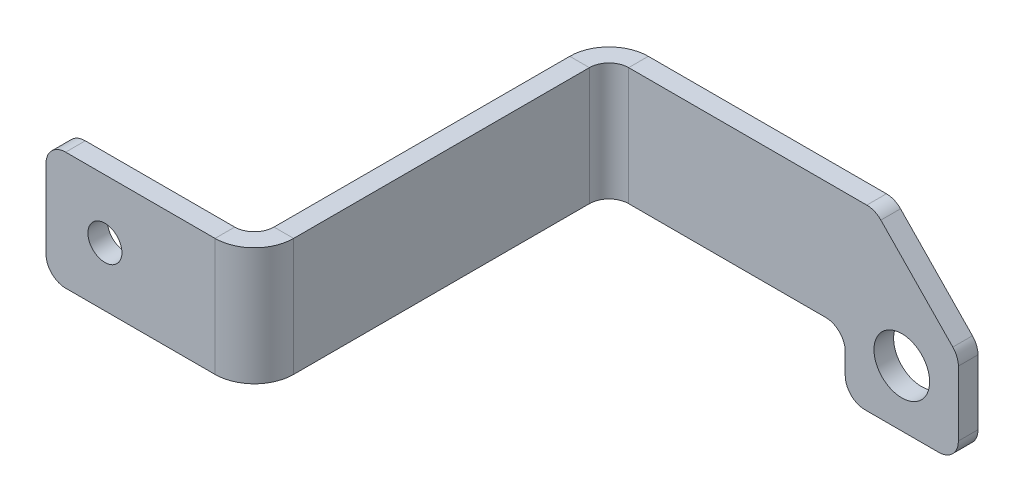
ISO-10303-21;
HEADER;
FILE_DESCRIPTION(('STEP AP214'),'2;1');
FILE_NAME('part.step','',(''),(''),'','','');
FILE_SCHEMA(('AUTOMOTIVE_DESIGN { 1 0 10303 214 1 1 1 1 }'));
ENDSEC;
DATA;
#1=APPLICATION_CONTEXT('core data for automotive mechanical design processes');
#2=APPLICATION_PROTOCOL_DEFINITION('international standard','automotive_design',2000,#1);
#3=PRODUCT_CONTEXT('',#1,'mechanical');
#4=PRODUCT('Part','Part','',(#3));
#5=PRODUCT_RELATED_PRODUCT_CATEGORY('part','',(#4));
#6=PRODUCT_DEFINITION_FORMATION('','',#4);
#7=PRODUCT_DEFINITION_CONTEXT('part definition',#1,'design');
#8=PRODUCT_DEFINITION('design','',#6,#7);
#9=PRODUCT_DEFINITION_SHAPE('','',#8);
#10=(LENGTH_UNIT() NAMED_UNIT(*) SI_UNIT(.MILLI.,.METRE.));
#11=(NAMED_UNIT(*) PLANE_ANGLE_UNIT() SI_UNIT($,.RADIAN.));
#12=(NAMED_UNIT(*) SI_UNIT($,.STERADIAN.) SOLID_ANGLE_UNIT());
#13=UNCERTAINTY_MEASURE_WITH_UNIT(LENGTH_MEASURE(1.E-05),#10,'distance_accuracy_value','');
#14=(GEOMETRIC_REPRESENTATION_CONTEXT(3) GLOBAL_UNCERTAINTY_ASSIGNED_CONTEXT((#13)) GLOBAL_UNIT_ASSIGNED_CONTEXT((#10,
#11,#12)) REPRESENTATION_CONTEXT('',''));
#15=CARTESIAN_POINT('',(0.,0.,0.));
#16=DIRECTION('',(0.,0.,1.));
#17=DIRECTION('',(1.,0.,0.));
#18=AXIS2_PLACEMENT_3D('',#15,#16,#17);
#19=CARTESIAN_POINT('',(24.1554000000002,-9.525,-57.34304));
#20=DIRECTION('',(0.,1.,0.));
#21=DIRECTION('',(0.,0.,1.));
#22=AXIS2_PLACEMENT_3D('',#19,#20,#21);
#23=PLANE('',#22);
#24=DIRECTION('',(-1.,0.,0.));
#25=VECTOR('',#24,1.);
#26=CARTESIAN_POINT('',(24.1554000000002,-9.525,-54.16804));
#27=LINE('',#26,#25);
#28=CARTESIAN_POINT('',(24.1554000000002,-9.525,-54.16804));
#29=VERTEX_POINT('',#28);
#30=CARTESIAN_POINT('',(20.9804000000002,-9.525,-54.16804));
#31=VERTEX_POINT('',#30);
#32=EDGE_CURVE('E283',#29,#31,#27,.T.);
#33=ORIENTED_EDGE('',*,*,#32,.F.);
#34=DIRECTION('',(0.,0.,-1.));
#35=VECTOR('',#34,1.);
#36=CARTESIAN_POINT('',(24.1554,-9.525,0.));
#37=LINE('',#36,#35);
#38=CARTESIAN_POINT('',(24.1554,-9.525,-6.34999999999998));
#39=VERTEX_POINT('',#38);
#40=EDGE_CURVE('E294',#39,#29,#37,.T.);
#41=ORIENTED_EDGE('',*,*,#40,.F.);
#42=DIRECTION('',(-1.,0.,0.));
#43=VECTOR('',#42,1.);
#44=CARTESIAN_POINT('',(20.9804,-9.525,-6.34999999999999));
#45=LINE('',#44,#43);
#46=CARTESIAN_POINT('',(20.9804,-9.525,-6.34999999999999));
#47=VERTEX_POINT('',#46);
#48=EDGE_CURVE('E305',#47,#39,#45,.F.);
#49=ORIENTED_EDGE('',*,*,#48,.F.);
#50=DIRECTION('',(0.,0.,1.));
#51=VECTOR('',#50,1.);
#52=CARTESIAN_POINT('',(20.9804000000002,-9.525,-57.34304));
#53=LINE('',#52,#51);
#54=EDGE_CURVE('E299',#47,#31,#53,.F.);
#55=ORIENTED_EDGE('',*,*,#54,.T.);
#56=EDGE_LOOP('',(#33,#41,#49,#55));
#57=FACE_BOUND('',#56,.T.);
#58=ADVANCED_FACE('F61',(#57),#23,.F.);
#59=CARTESIAN_POINT('',(24.1554,9.525,-3.17499999999999));
#60=DIRECTION('',(0.,-1.,0.));
#61=DIRECTION('',(0.,0.,-1.));
#62=AXIS2_PLACEMENT_3D('',#59,#60,#61);
#63=PLANE('',#62);
#64=DIRECTION('',(-1.,0.,0.));
#65=VECTOR('',#64,1.);
#66=CARTESIAN_POINT('',(24.1554000000002,9.525,-54.16804));
#67=LINE('',#66,#65);
#68=CARTESIAN_POINT('',(24.1554000000002,9.525,-54.16804));
#69=VERTEX_POINT('',#68);
#70=CARTESIAN_POINT('',(20.9804000000002,9.525,-54.16804));
#71=VERTEX_POINT('',#70);
#72=EDGE_CURVE('E276',#69,#71,#67,.T.);
#73=ORIENTED_EDGE('',*,*,#72,.T.);
#74=DIRECTION('',(0.,0.,-1.));
#75=VECTOR('',#74,1.);
#76=CARTESIAN_POINT('',(20.9804,9.525,-3.175));
#77=LINE('',#76,#75);
#78=CARTESIAN_POINT('',(20.9804,9.52499999999999,-6.34999999999999));
#79=VERTEX_POINT('',#78);
#80=EDGE_CURVE('E297',#71,#79,#77,.F.);
#81=ORIENTED_EDGE('',*,*,#80,.T.);
#82=DIRECTION('',(-1.,0.,0.));
#83=VECTOR('',#82,1.);
#84=CARTESIAN_POINT('',(24.1554,9.525,-6.34999999999998));
#85=LINE('',#84,#83);
#86=CARTESIAN_POINT('',(24.1554,9.52499999999998,-6.34999999999998));
#87=VERTEX_POINT('',#86);
#88=EDGE_CURVE('E310',#79,#87,#85,.F.);
#89=ORIENTED_EDGE('',*,*,#88,.T.);
#90=DIRECTION('',(0.,0.,1.));
#91=VECTOR('',#90,1.);
#92=CARTESIAN_POINT('',(24.1554,9.525,0.));
#93=LINE('',#92,#91);
#94=EDGE_CURVE('E291',#69,#87,#93,.T.);
#95=ORIENTED_EDGE('',*,*,#94,.F.);
#96=EDGE_LOOP('',(#73,#81,#89,#95));
#97=FACE_BOUND('',#96,.T.);
#98=ADVANCED_FACE('F452',(#97),#63,.F.);
#99=CARTESIAN_POINT('',(24.1554,0.,0.));
#100=DIRECTION('',(-1.,0.,0.));
#101=DIRECTION('',(0.,0.,1.));
#102=AXIS2_PLACEMENT_3D('',#99,#100,#101);
#103=PLANE('',#102);
#104=DIRECTION('',(0.,1.,0.));
#105=VECTOR('',#104,1.);
#106=CARTESIAN_POINT('',(24.1554000000002,9.525,-54.16804));
#107=LINE('',#106,#105);
#108=EDGE_CURVE('E280',#69,#29,#107,.F.);
#109=ORIENTED_EDGE('',*,*,#108,.F.);
#110=ORIENTED_EDGE('',*,*,#94,.T.);
#111=DIRECTION('',(0.,-1.,0.));
#112=VECTOR('',#111,1.);
#113=CARTESIAN_POINT('',(24.1554,9.525,-6.34999999999998));
#114=LINE('',#113,#112);
#115=EDGE_CURVE('E302',#39,#87,#114,.F.);
#116=ORIENTED_EDGE('',*,*,#115,.F.);
#117=ORIENTED_EDGE('',*,*,#40,.T.);
#118=EDGE_LOOP('',(#109,#110,#116,#117));
#119=FACE_BOUND('',#118,.T.);
#120=ADVANCED_FACE('F458',(#119),#103,.F.);
#121=CARTESIAN_POINT('',(20.9804,0.,0.));
#122=DIRECTION('',(-1.,0.,0.));
#123=DIRECTION('',(0.,0.,1.));
#124=AXIS2_PLACEMENT_3D('',#121,#122,#123);
#125=PLANE('',#124);
#126=ORIENTED_EDGE('',*,*,#80,.F.);
#127=DIRECTION('',(0.,1.,0.));
#128=VECTOR('',#127,1.);
#129=CARTESIAN_POINT('',(20.9804000000002,9.525,-54.16804));
#130=LINE('',#129,#128);
#131=EDGE_CURVE('E218',#71,#31,#130,.F.);
#132=ORIENTED_EDGE('',*,*,#131,.T.);
#133=ORIENTED_EDGE('',*,*,#54,.F.);
#134=DIRECTION('',(0.,-1.,0.));
#135=VECTOR('',#134,1.);
#136=CARTESIAN_POINT('',(20.9804,9.525,-6.34999999999999));
#137=LINE('',#136,#135);
#138=EDGE_CURVE('E308',#79,#47,#137,.T.);
#139=ORIENTED_EDGE('',*,*,#138,.F.);
#140=EDGE_LOOP('',(#126,#132,#133,#139));
#141=FACE_BOUND('',#140,.T.);
#142=ADVANCED_FACE('F497',(#141),#125,.T.);
#143=CARTESIAN_POINT('',(-9.525,-9.525,-3.175));
#144=DIRECTION('',(0.,-1.,0.));
#145=DIRECTION('',(0.,0.,-1.));
#146=AXIS2_PLACEMENT_3D('',#143,#144,#145);
#147=PLANE('',#146);
#148=DIRECTION('',(1.,0.,0.));
#149=VECTOR('',#148,1.);
#150=CARTESIAN_POINT('',(-9.525,-9.525,0.));
#151=LINE('',#150,#149);
#152=CARTESIAN_POINT('',(-6.35,-9.525,0.));
#153=VERTEX_POINT('',#152);
#154=CARTESIAN_POINT('',(17.8054,-9.525,0.));
#155=VERTEX_POINT('',#154);
#156=EDGE_CURVE('E348',#153,#155,#151,.T.);
#157=ORIENTED_EDGE('',*,*,#156,.F.);
#158=DIRECTION('',(0.,0.,1.));
#159=VECTOR('',#158,1.);
#160=CARTESIAN_POINT('',(-6.35,-9.525,-3.175));
#161=LINE('',#160,#159);
#162=CARTESIAN_POINT('',(-6.35,-9.525,-3.175));
#163=VERTEX_POINT('',#162);
#164=EDGE_CURVE('E374',#153,#163,#161,.F.);
#165=ORIENTED_EDGE('',*,*,#164,.T.);
#166=DIRECTION('',(1.,0.,0.));
#167=VECTOR('',#166,1.);
#168=CARTESIAN_POINT('',(-9.525,-9.525,-3.175));
#169=LINE('',#168,#167);
#170=CARTESIAN_POINT('',(17.8054,-9.525,-3.175));
#171=VERTEX_POINT('',#170);
#172=EDGE_CURVE('E339',#163,#171,#169,.T.);
#173=ORIENTED_EDGE('',*,*,#172,.T.);
#174=DIRECTION('',(0.,0.,1.));
#175=VECTOR('',#174,1.);
#176=CARTESIAN_POINT('',(17.8054,-9.525,-3.175));
#177=LINE('',#176,#175);
#178=EDGE_CURVE('E319',#171,#155,#177,.T.);
#179=ORIENTED_EDGE('',*,*,#178,.T.);
#180=EDGE_LOOP('',(#157,#165,#173,#179));
#181=FACE_BOUND('',#180,.T.);
#182=ADVANCED_FACE('F486',(#181),#147,.T.);
#183=CARTESIAN_POINT('',(0.,0.,-3.175));
#184=DIRECTION('',(0.,0.,-1.));
#185=DIRECTION('',(-1.,0.,0.));
#186=AXIS2_PLACEMENT_3D('',#183,#184,#185);
#187=PLANE('',#186);
#188=CARTESIAN_POINT('',(0.,0.,-3.175));
#189=DIRECTION('',(0.,0.,-1.));
#190=DIRECTION('',(-1.,0.,0.));
#191=AXIS2_PLACEMENT_3D('',#188,#189,#190);
#192=CIRCLE('',#191,2.74999999999999);
#193=CARTESIAN_POINT('',(-2.74999999999999,0.,-3.175));
#194=VERTEX_POINT('',#193);
#195=EDGE_CURVE('E290',#194,#194,#192,.T.);
#196=ORIENTED_EDGE('',*,*,#195,.F.);
#197=EDGE_LOOP('',(#196));
#198=FACE_BOUND('',#197,.T.);
#199=DIRECTION('',(0.,-1.,0.));
#200=VECTOR('',#199,1.);
#201=CARTESIAN_POINT('',(-9.525,-9.525,-3.175));
#202=LINE('',#201,#200);
#203=CARTESIAN_POINT('',(-9.525,6.35,-3.175));
#204=VERTEX_POINT('',#203);
#205=CARTESIAN_POINT('',(-9.525,-6.35,-3.175));
#206=VERTEX_POINT('',#205);
#207=EDGE_CURVE('E336',#204,#206,#202,.T.);
#208=ORIENTED_EDGE('',*,*,#207,.F.);
#209=CARTESIAN_POINT('',(-6.35,6.35,-3.175));
#210=DIRECTION('',(0.,0.,-1.));
#211=DIRECTION('',(-1.,0.,0.));
#212=AXIS2_PLACEMENT_3D('',#209,#210,#211);
#213=CIRCLE('',#212,3.175);
#214=CARTESIAN_POINT('',(-6.35,9.525,-3.175));
#215=VERTEX_POINT('',#214);
#216=EDGE_CURVE('E372',#204,#215,#213,.T.);
#217=ORIENTED_EDGE('',*,*,#216,.T.);
#218=DIRECTION('',(-1.,0.,0.));
#219=VECTOR('',#218,1.);
#220=CARTESIAN_POINT('',(-9.525,9.525,-3.175));
#221=LINE('',#220,#219);
#222=CARTESIAN_POINT('',(17.8054,9.525,-3.175));
#223=VERTEX_POINT('',#222);
#224=EDGE_CURVE('E342',#223,#215,#221,.T.);
#225=ORIENTED_EDGE('',*,*,#224,.F.);
#226=DIRECTION('',(0.,-1.,0.));
#227=VECTOR('',#226,1.);
#228=CARTESIAN_POINT('',(17.8054,-9.525,-3.175));
#229=LINE('',#228,#227);
#230=EDGE_CURVE('E325',#171,#223,#229,.F.);
#231=ORIENTED_EDGE('',*,*,#230,.F.);
#232=ORIENTED_EDGE('',*,*,#172,.F.);
#233=CARTESIAN_POINT('',(-6.35,-6.35,-3.175));
#234=DIRECTION('',(0.,0.,-1.));
#235=DIRECTION('',(-1.,0.,0.));
#236=AXIS2_PLACEMENT_3D('',#233,#234,#235);
#237=CIRCLE('',#236,3.175);
#238=EDGE_CURVE('E370',#163,#206,#237,.T.);
#239=ORIENTED_EDGE('',*,*,#238,.T.);
#240=EDGE_LOOP('',(#208,#217,#225,#231,#232,#239));
#241=FACE_BOUND('',#240,.T.);
#242=ADVANCED_FACE('F482',(#198,#241),#187,.T.);
#243=CARTESIAN_POINT('',(0.,0.,0.));
#244=DIRECTION('',(0.,0.,-1.));
#245=DIRECTION('',(-1.,0.,0.));
#246=AXIS2_PLACEMENT_3D('',#243,#244,#245);
#247=PLANE('',#246);
#248=CARTESIAN_POINT('',(0.,0.,0.));
#249=DIRECTION('',(0.,0.,1.));
#250=DIRECTION('',(1.,0.,0.));
#251=AXIS2_PLACEMENT_3D('',#248,#249,#250);
#252=CIRCLE('',#251,2.75);
#253=CARTESIAN_POINT('',(2.75,0.,0.));
#254=VERTEX_POINT('',#253);
#255=EDGE_CURVE('E286',#254,#254,#252,.T.);
#256=ORIENTED_EDGE('',*,*,#255,.F.);
#257=EDGE_LOOP('',(#256));
#258=FACE_BOUND('',#257,.T.);
#259=DIRECTION('',(-1.,0.,0.));
#260=VECTOR('',#259,1.);
#261=CARTESIAN_POINT('',(-9.525,9.525,0.));
#262=LINE('',#261,#260);
#263=CARTESIAN_POINT('',(17.8054,9.525,0.));
#264=VERTEX_POINT('',#263);
#265=CARTESIAN_POINT('',(-6.35,9.525,0.));
#266=VERTEX_POINT('',#265);
#267=EDGE_CURVE('E340',#264,#266,#262,.T.);
#268=ORIENTED_EDGE('',*,*,#267,.T.);
#269=CARTESIAN_POINT('',(-6.35,6.35,0.));
#270=DIRECTION('',(0.,0.,-1.));
#271=DIRECTION('',(-1.,0.,0.));
#272=AXIS2_PLACEMENT_3D('',#269,#270,#271);
#273=CIRCLE('',#272,3.175);
#274=CARTESIAN_POINT('',(-9.525,6.35,0.));
#275=VERTEX_POINT('',#274);
#276=EDGE_CURVE('E363',#266,#275,#273,.F.);
#277=ORIENTED_EDGE('',*,*,#276,.T.);
#278=DIRECTION('',(0.,-1.,0.));
#279=VECTOR('',#278,1.);
#280=CARTESIAN_POINT('',(-9.525,-9.525,0.));
#281=LINE('',#280,#279);
#282=CARTESIAN_POINT('',(-9.525,-6.35,0.));
#283=VERTEX_POINT('',#282);
#284=EDGE_CURVE('E333',#275,#283,#281,.T.);
#285=ORIENTED_EDGE('',*,*,#284,.T.);
#286=CARTESIAN_POINT('',(-6.35,-6.35,0.));
#287=DIRECTION('',(0.,0.,-1.));
#288=DIRECTION('',(-1.,0.,0.));
#289=AXIS2_PLACEMENT_3D('',#286,#287,#288);
#290=CIRCLE('',#289,3.175);
#291=EDGE_CURVE('E361',#283,#153,#290,.F.);
#292=ORIENTED_EDGE('',*,*,#291,.T.);
#293=ORIENTED_EDGE('',*,*,#156,.T.);
#294=DIRECTION('',(0.,-1.,0.));
#295=VECTOR('',#294,1.);
#296=CARTESIAN_POINT('',(17.8054,-9.525,0.));
#297=LINE('',#296,#295);
#298=EDGE_CURVE('E313',#155,#264,#297,.F.);
#299=ORIENTED_EDGE('',*,*,#298,.T.);
#300=EDGE_LOOP('',(#268,#277,#285,#292,#293,#299));
#301=FACE_BOUND('',#300,.T.);
#302=ADVANCED_FACE('F485',(#258,#301),#247,.F.);
#303=CARTESIAN_POINT('',(-9.525,-9.525,-3.175));
#304=DIRECTION('',(-1.,0.,0.));
#305=DIRECTION('',(0.,0.,1.));
#306=AXIS2_PLACEMENT_3D('',#303,#304,#305);
#307=PLANE('',#306);
#308=ORIENTED_EDGE('',*,*,#284,.F.);
#309=DIRECTION('',(0.,0.,1.));
#310=VECTOR('',#309,1.);
#311=CARTESIAN_POINT('',(-9.525,6.35,-3.175));
#312=LINE('',#311,#310);
#313=EDGE_CURVE('E368',#275,#204,#312,.F.);
#314=ORIENTED_EDGE('',*,*,#313,.T.);
#315=ORIENTED_EDGE('',*,*,#207,.T.);
#316=DIRECTION('',(0.,0.,1.));
#317=VECTOR('',#316,1.);
#318=CARTESIAN_POINT('',(-9.525,-6.35,-3.175));
#319=LINE('',#318,#317);
#320=EDGE_CURVE('E365',#206,#283,#319,.T.);
#321=ORIENTED_EDGE('',*,*,#320,.T.);
#322=EDGE_LOOP('',(#308,#314,#315,#321));
#323=FACE_BOUND('',#322,.T.);
#324=ADVANCED_FACE('F490',(#323),#307,.T.);
#325=CARTESIAN_POINT('',(-9.525,9.525,-3.175));
#326=DIRECTION('',(0.,1.,0.));
#327=DIRECTION('',(0.,0.,1.));
#328=AXIS2_PLACEMENT_3D('',#325,#326,#327);
#329=PLANE('',#328);
#330=ORIENTED_EDGE('',*,*,#224,.T.);
#331=DIRECTION('',(0.,0.,1.));
#332=VECTOR('',#331,1.);
#333=CARTESIAN_POINT('',(-6.35,9.525,-3.175));
#334=LINE('',#333,#332);
#335=EDGE_CURVE('E345',#215,#266,#334,.T.);
#336=ORIENTED_EDGE('',*,*,#335,.T.);
#337=ORIENTED_EDGE('',*,*,#267,.F.);
#338=DIRECTION('',(0.,0.,1.));
#339=VECTOR('',#338,1.);
#340=CARTESIAN_POINT('',(17.8054,9.52499999999999,-3.175));
#341=LINE('',#340,#339);
#342=EDGE_CURVE('E330',#223,#264,#341,.T.);
#343=ORIENTED_EDGE('',*,*,#342,.F.);
#344=EDGE_LOOP('',(#330,#336,#337,#343));
#345=FACE_BOUND('',#344,.T.);
#346=ADVANCED_FACE('F477',(#345),#329,.T.);
#347=CARTESIAN_POINT('',(17.8054,9.52499999999999,-6.35));
#348=DIRECTION('',(0.,1.,0.));
#349=DIRECTION('',(0.,0.,1.));
#350=AXIS2_PLACEMENT_3D('',#347,#348,#349);
#351=PLANE('',#350);
#352=ORIENTED_EDGE('',*,*,#88,.F.);
#353=CARTESIAN_POINT('',(17.8054,9.52499999999999,-6.35));
#354=DIRECTION('',(0.,-1.,0.));
#355=DIRECTION('',(0.,0.,-1.));
#356=AXIS2_PLACEMENT_3D('',#353,#354,#355);
#357=CIRCLE('',#356,3.175);
#358=EDGE_CURVE('E322',#223,#79,#357,.F.);
#359=ORIENTED_EDGE('',*,*,#358,.F.);
#360=ORIENTED_EDGE('',*,*,#342,.T.);
#361=CARTESIAN_POINT('',(17.8054,9.52499999999998,-6.35));
#362=DIRECTION('',(0.,-1.,0.));
#363=DIRECTION('',(0.,0.,-1.));
#364=AXIS2_PLACEMENT_3D('',#361,#362,#363);
#365=CIRCLE('',#364,6.35);
#366=EDGE_CURVE('E315',#264,#87,#365,.F.);
#367=ORIENTED_EDGE('',*,*,#366,.T.);
#368=EDGE_LOOP('',(#352,#359,#360,#367));
#369=FACE_BOUND('',#368,.T.);
#370=ADVANCED_FACE('F474',(#369),#351,.T.);
#371=CARTESIAN_POINT('',(17.8054,-9.525,-6.35));
#372=DIRECTION('',(0.,1.,0.));
#373=DIRECTION('',(0.,0.,1.));
#374=AXIS2_PLACEMENT_3D('',#371,#372,#373);
#375=PLANE('',#374);
#376=CARTESIAN_POINT('',(17.8054,-9.525,-6.35));
#377=DIRECTION('',(0.,-1.,0.));
#378=DIRECTION('',(0.,0.,-1.));
#379=AXIS2_PLACEMENT_3D('',#376,#377,#378);
#380=CIRCLE('',#379,3.175);
#381=EDGE_CURVE('E293',#47,#171,#380,.T.);
#382=ORIENTED_EDGE('',*,*,#381,.F.);
#383=ORIENTED_EDGE('',*,*,#48,.T.);
#384=CARTESIAN_POINT('',(17.8054,-9.525,-6.35));
#385=DIRECTION('',(0.,-1.,0.));
#386=DIRECTION('',(0.,0.,-1.));
#387=AXIS2_PLACEMENT_3D('',#384,#385,#386);
#388=CIRCLE('',#387,6.35);
#389=EDGE_CURVE('E316',#39,#155,#388,.T.);
#390=ORIENTED_EDGE('',*,*,#389,.T.);
#391=ORIENTED_EDGE('',*,*,#178,.F.);
#392=EDGE_LOOP('',(#382,#383,#390,#391));
#393=FACE_BOUND('',#392,.T.);
#394=ADVANCED_FACE('F468',(#393),#375,.F.);
#395=CARTESIAN_POINT('',(17.8054,-9.525,-6.35));
#396=DIRECTION('',(0.,-1.,0.));
#397=DIRECTION('',(1.,0.,0.));
#398=AXIS2_PLACEMENT_3D('',#395,#396,#397);
#399=CYLINDRICAL_SURFACE('',#398,6.35);
#400=ORIENTED_EDGE('',*,*,#298,.F.);
#401=ORIENTED_EDGE('',*,*,#389,.F.);
#402=ORIENTED_EDGE('',*,*,#115,.T.);
#403=ORIENTED_EDGE('',*,*,#366,.F.);
#404=EDGE_LOOP('',(#400,#401,#402,#403));
#405=FACE_BOUND('',#404,.T.);
#406=ADVANCED_FACE('F464',(#405),#399,.T.);
#407=CARTESIAN_POINT('',(17.8054,-9.525,-6.35));
#408=DIRECTION('',(0.,-1.,0.));
#409=DIRECTION('',(1.,0.,0.));
#410=AXIS2_PLACEMENT_3D('',#407,#408,#409);
#411=CYLINDRICAL_SURFACE('',#410,3.175);
#412=ORIENTED_EDGE('',*,*,#230,.T.);
#413=ORIENTED_EDGE('',*,*,#358,.T.);
#414=ORIENTED_EDGE('',*,*,#138,.T.);
#415=ORIENTED_EDGE('',*,*,#381,.T.);
#416=EDGE_LOOP('',(#412,#413,#414,#415));
#417=FACE_BOUND('',#416,.T.);
#418=ADVANCED_FACE('F467',(#417),#411,.F.);
#419=CARTESIAN_POINT('',(0.,0.,0.));
#420=DIRECTION('',(0.,0.,1.));
#421=DIRECTION('',(1.,0.,0.));
#422=AXIS2_PLACEMENT_3D('',#419,#420,#421);
#423=CYLINDRICAL_SURFACE('',#422,2.74999999999999);
#424=ORIENTED_EDGE('',*,*,#195,.T.);
#425=EDGE_LOOP('',(#424));
#426=FACE_BOUND('',#425,.T.);
#427=ORIENTED_EDGE('',*,*,#255,.T.);
#428=EDGE_LOOP('',(#427));
#429=FACE_BOUND('',#428,.T.);
#430=ADVANCED_FACE('F472',(#426,#429),#423,.F.);
#431=CARTESIAN_POINT('',(27.3304000000002,-9.525,-54.16804));
#432=DIRECTION('',(0.,-1.,0.));
#433=DIRECTION('',(0.,0.,-1.));
#434=AXIS2_PLACEMENT_3D('',#431,#432,#433);
#435=PLANE('',#434);
#436=DIRECTION('',(0.,0.,-1.));
#437=VECTOR('',#436,1.);
#438=CARTESIAN_POINT('',(27.3304000000002,-9.525,-57.34304));
#439=LINE('',#438,#437);
#440=CARTESIAN_POINT('',(27.3304000000002,-9.525,-57.34304));
#441=VERTEX_POINT('',#440);
#442=CARTESIAN_POINT('',(27.3304000000002,-9.525,-60.51804));
#443=VERTEX_POINT('',#442);
#444=EDGE_CURVE('E357',#441,#443,#439,.T.);
#445=ORIENTED_EDGE('',*,*,#444,.F.);
#446=CARTESIAN_POINT('',(27.3304000000002,-9.525,-54.16804));
#447=DIRECTION('',(0.,1.,0.));
#448=DIRECTION('',(0.,0.,1.));
#449=AXIS2_PLACEMENT_3D('',#446,#447,#448);
#450=CIRCLE('',#449,3.17500000000001);
#451=EDGE_CURVE('E221',#29,#441,#450,.F.);
#452=ORIENTED_EDGE('',*,*,#451,.F.);
#453=ORIENTED_EDGE('',*,*,#32,.T.);
#454=CARTESIAN_POINT('',(27.3304000000002,-9.525,-54.16804));
#455=DIRECTION('',(0.,1.,0.));
#456=DIRECTION('',(0.,0.,1.));
#457=AXIS2_PLACEMENT_3D('',#454,#455,#456);
#458=CIRCLE('',#457,6.35000000000001);
#459=EDGE_CURVE('E275',#31,#443,#458,.F.);
#460=ORIENTED_EDGE('',*,*,#459,.T.);
#461=EDGE_LOOP('',(#445,#452,#453,#460));
#462=FACE_BOUND('',#461,.T.);
#463=ADVANCED_FACE('F548',(#462),#435,.T.);
#464=CARTESIAN_POINT('',(27.3304000000002,9.525,-54.16804));
#465=DIRECTION('',(0.,-1.,0.));
#466=DIRECTION('',(0.,0.,-1.));
#467=AXIS2_PLACEMENT_3D('',#464,#465,#466);
#468=PLANE('',#467);
#469=CARTESIAN_POINT('',(27.3304000000002,9.525,-54.16804));
#470=DIRECTION('',(0.,1.,0.));
#471=DIRECTION('',(0.,0.,1.));
#472=AXIS2_PLACEMENT_3D('',#469,#470,#471);
#473=CIRCLE('',#472,3.17500000000001);
#474=CARTESIAN_POINT('',(27.3304000000002,9.525,-57.34304));
#475=VERTEX_POINT('',#474);
#476=EDGE_CURVE('E228',#475,#69,#473,.T.);
#477=ORIENTED_EDGE('',*,*,#476,.F.);
#478=DIRECTION('',(0.,0.,-1.));
#479=VECTOR('',#478,1.);
#480=CARTESIAN_POINT('',(27.3304000000002,9.525,-57.34304));
#481=LINE('',#480,#479);
#482=CARTESIAN_POINT('',(27.3304000000002,9.525,-60.51804));
#483=VERTEX_POINT('',#482);
#484=EDGE_CURVE('E225',#475,#483,#481,.T.);
#485=ORIENTED_EDGE('',*,*,#484,.T.);
#486=CARTESIAN_POINT('',(27.3304000000002,9.525,-54.16804));
#487=DIRECTION('',(0.,1.,0.));
#488=DIRECTION('',(0.,0.,1.));
#489=AXIS2_PLACEMENT_3D('',#486,#487,#488);
#490=CIRCLE('',#489,6.35000000000001);
#491=EDGE_CURVE('E211',#483,#71,#490,.T.);
#492=ORIENTED_EDGE('',*,*,#491,.T.);
#493=ORIENTED_EDGE('',*,*,#72,.F.);
#494=EDGE_LOOP('',(#477,#485,#492,#493));
#495=FACE_BOUND('',#494,.T.);
#496=ADVANCED_FACE('F226',(#495),#468,.F.);
#497=CARTESIAN_POINT('',(27.3304000000002,9.525,-54.16804));
#498=DIRECTION('',(0.,1.,0.));
#499=DIRECTION('',(0.,0.,-1.));
#500=AXIS2_PLACEMENT_3D('',#497,#498,#499);
#501=CYLINDRICAL_SURFACE('',#500,6.35000000000001);
#502=ORIENTED_EDGE('',*,*,#131,.F.);
#503=ORIENTED_EDGE('',*,*,#491,.F.);
#504=DIRECTION('',(0.,1.,0.));
#505=VECTOR('',#504,1.);
#506=CARTESIAN_POINT('',(27.3304000000002,0.,-60.51804));
#507=LINE('',#506,#505);
#508=EDGE_CURVE('E215',#443,#483,#507,.T.);
#509=ORIENTED_EDGE('',*,*,#508,.F.);
#510=ORIENTED_EDGE('',*,*,#459,.F.);
#511=EDGE_LOOP('',(#502,#503,#509,#510));
#512=FACE_BOUND('',#511,.T.);
#513=ADVANCED_FACE('F213',(#512),#501,.T.);
#514=CARTESIAN_POINT('',(27.3304000000002,9.525,-54.16804));
#515=DIRECTION('',(0.,1.,0.));
#516=DIRECTION('',(0.,0.,-1.));
#517=AXIS2_PLACEMENT_3D('',#514,#515,#516);
#518=CYLINDRICAL_SURFACE('',#517,3.17500000000001);
#519=ORIENTED_EDGE('',*,*,#108,.T.);
#520=ORIENTED_EDGE('',*,*,#451,.T.);
#521=DIRECTION('',(0.,1.,0.));
#522=VECTOR('',#521,1.);
#523=CARTESIAN_POINT('',(27.3304000000002,-9.525,-57.34304));
#524=LINE('',#523,#522);
#525=EDGE_CURVE('E233',#441,#475,#524,.T.);
#526=ORIENTED_EDGE('',*,*,#525,.T.);
#527=ORIENTED_EDGE('',*,*,#476,.T.);
#528=EDGE_LOOP('',(#519,#520,#526,#527));
#529=FACE_BOUND('',#528,.T.);
#530=ADVANCED_FACE('F440',(#529),#518,.F.);
#531=CARTESIAN_POINT('',(0.,0.,-60.51804));
#532=DIRECTION('',(0.,0.,-1.));
#533=DIRECTION('',(-1.,0.,0.));
#534=AXIS2_PLACEMENT_3D('',#531,#532,#533);
#535=PLANE('',#534);
#536=CARTESIAN_POINT('',(71.488427,-10.1346,-60.51804));
#537=DIRECTION('',(0.,0.,-1.));
#538=DIRECTION('',(-1.,0.,0.));
#539=AXIS2_PLACEMENT_3D('',#536,#537,#538);
#540=CIRCLE('',#539,4.5);
#541=CARTESIAN_POINT('',(66.988427,-10.1346,-60.51804));
#542=VERTEX_POINT('',#541);
#543=EDGE_CURVE('E358',#542,#542,#540,.T.);
#544=ORIENTED_EDGE('',*,*,#543,.F.);
#545=EDGE_LOOP('',(#544));
#546=FACE_BOUND('',#545,.T.);
#547=DIRECTION('',(1.,0.,0.));
#548=VECTOR('',#547,1.);
#549=CARTESIAN_POINT('',(24.1554000000002,9.525,-60.51804));
#550=LINE('',#549,#548);
#551=CARTESIAN_POINT('',(65.827920004609,9.525,-60.51804));
#552=VERTEX_POINT('',#551);
#553=EDGE_CURVE('E237',#483,#552,#550,.T.);
#554=ORIENTED_EDGE('',*,*,#553,.T.);
#555=CARTESIAN_POINT('',(65.827920004609,6.35,-60.51804));
#556=DIRECTION('',(0.,0.,-1.));
#557=DIRECTION('',(-1.,0.,0.));
#558=AXIS2_PLACEMENT_3D('',#555,#556,#557);
#559=CIRCLE('',#558,3.175);
#560=CARTESIAN_POINT('',(68.1046768136406,8.56291740300636,-60.51804));
#561=VERTEX_POINT('',#560);
#562=EDGE_CURVE('E395',#552,#561,#559,.T.);
#563=ORIENTED_EDGE('',*,*,#562,.T.);
#564=DIRECTION('',(0.696981859214602,-0.717088758750099,0.));
#565=VECTOR('',#564,1.);
#566=CARTESIAN_POINT('',(67.169570651414,9.525,-60.51804));
#567=LINE('',#566,#565);
#568=CARTESIAN_POINT('',(79.7341838090316,-3.40208373145327,-60.51804));
#569=VERTEX_POINT('',#568);
#570=EDGE_CURVE('E246',#561,#569,#567,.T.);
#571=ORIENTED_EDGE('',*,*,#570,.T.);
#572=CARTESIAN_POINT('',(77.457427,-5.61500113445963,-60.51804));
#573=DIRECTION('',(0.,0.,-1.));
#574=DIRECTION('',(-1.,0.,0.));
#575=AXIS2_PLACEMENT_3D('',#572,#573,#574);
#576=CIRCLE('',#575,3.175);
#577=CARTESIAN_POINT('',(80.632427,-5.61500113445963,-60.51804));
#578=VERTEX_POINT('',#577);
#579=EDGE_CURVE('E390',#569,#578,#576,.T.);
#580=ORIENTED_EDGE('',*,*,#579,.T.);
#581=DIRECTION('',(0.,-1.,0.));
#582=VECTOR('',#581,1.);
#583=CARTESIAN_POINT('',(80.632427,-4.32623991479082,-60.51804));
#584=LINE('',#583,#582);
#585=CARTESIAN_POINT('',(80.632427,-16.1036,-60.51804));
#586=VERTEX_POINT('',#585);
#587=EDGE_CURVE('E250',#578,#586,#584,.T.);
#588=ORIENTED_EDGE('',*,*,#587,.T.);
#589=CARTESIAN_POINT('',(77.457427,-16.1036,-60.51804));
#590=DIRECTION('',(0.,0.,-1.));
#591=DIRECTION('',(-1.,0.,0.));
#592=AXIS2_PLACEMENT_3D('',#589,#590,#591);
#593=CIRCLE('',#592,3.175);
#594=CARTESIAN_POINT('',(77.457427,-19.2786,-60.51804));
#595=VERTEX_POINT('',#594);
#596=EDGE_CURVE('E393',#586,#595,#593,.T.);
#597=ORIENTED_EDGE('',*,*,#596,.T.);
#598=DIRECTION('',(-1.,0.,0.));
#599=VECTOR('',#598,1.);
#600=CARTESIAN_POINT('',(80.632427,-19.2786,-60.51804));
#601=LINE('',#600,#599);
#602=CARTESIAN_POINT('',(65.519427,-19.2786,-60.51804));
#603=VERTEX_POINT('',#602);
#604=EDGE_CURVE('E258',#595,#603,#601,.T.);
#605=ORIENTED_EDGE('',*,*,#604,.T.);
#606=CARTESIAN_POINT('',(65.519427,-16.1036,-60.51804));
#607=DIRECTION('',(0.,0.,-1.));
#608=DIRECTION('',(-1.,0.,0.));
#609=AXIS2_PLACEMENT_3D('',#606,#607,#608);
#610=CIRCLE('',#609,3.175);
#611=CARTESIAN_POINT('',(62.344427,-16.1036,-60.51804));
#612=VERTEX_POINT('',#611);
#613=EDGE_CURVE('E83',#603,#612,#610,.T.);
#614=ORIENTED_EDGE('',*,*,#613,.T.);
#615=DIRECTION('',(0.,1.,0.));
#616=VECTOR('',#615,1.);
#617=CARTESIAN_POINT('',(62.344427,-9.525,-60.51804));
#618=LINE('',#617,#616);
#619=CARTESIAN_POINT('',(62.344427,-12.7,-60.51804));
#620=VERTEX_POINT('',#619);
#621=EDGE_CURVE('E260',#612,#620,#618,.T.);
#622=ORIENTED_EDGE('',*,*,#621,.T.);
#623=CARTESIAN_POINT('',(59.169427,-12.7,-60.51804));
#624=DIRECTION('',(0.,0.,-1.));
#625=DIRECTION('',(-1.,0.,0.));
#626=AXIS2_PLACEMENT_3D('',#623,#624,#625);
#627=CIRCLE('',#626,3.175);
#628=CARTESIAN_POINT('',(59.169427,-9.525,-60.51804));
#629=VERTEX_POINT('',#628);
#630=EDGE_CURVE('E13',#620,#629,#627,.F.);
#631=ORIENTED_EDGE('',*,*,#630,.T.);
#632=DIRECTION('',(-1.,0.,0.));
#633=VECTOR('',#632,1.);
#634=CARTESIAN_POINT('',(24.1554000000002,-9.525,-60.51804));
#635=LINE('',#634,#633);
#636=EDGE_CURVE('E240',#629,#443,#635,.T.);
#637=ORIENTED_EDGE('',*,*,#636,.T.);
#638=ORIENTED_EDGE('',*,*,#508,.T.);
#639=EDGE_LOOP('',(#554,#563,#571,#580,#588,#597,#605,#614,#622,#631,#637,#638));
#640=FACE_BOUND('',#639,.T.);
#641=ADVANCED_FACE('F236',(#546,#640),#535,.T.);
#642=CARTESIAN_POINT('',(0.,0.,-57.34304));
#643=DIRECTION('',(0.,0.,-1.));
#644=DIRECTION('',(-1.,0.,0.));
#645=AXIS2_PLACEMENT_3D('',#642,#643,#644);
#646=PLANE('',#645);
#647=CARTESIAN_POINT('',(71.488427,-10.1346,-57.34304));
#648=DIRECTION('',(0.,0.,-1.));
#649=DIRECTION('',(-1.,0.,0.));
#650=AXIS2_PLACEMENT_3D('',#647,#648,#649);
#651=CIRCLE('',#650,4.5);
#652=CARTESIAN_POINT('',(66.988427,-10.1346,-57.34304));
#653=VERTEX_POINT('',#652);
#654=EDGE_CURVE('E354',#653,#653,#651,.T.);
#655=ORIENTED_EDGE('',*,*,#654,.T.);
#656=EDGE_LOOP('',(#655));
#657=FACE_BOUND('',#656,.T.);
#658=DIRECTION('',(0.696981859214602,-0.717088758750099,0.));
#659=VECTOR('',#658,1.);
#660=CARTESIAN_POINT('',(67.169570651414,9.525,-57.34304));
#661=LINE('',#660,#659);
#662=CARTESIAN_POINT('',(68.1046768136406,8.56291740300636,-57.34304));
#663=VERTEX_POINT('',#662);
#664=CARTESIAN_POINT('',(79.7341838090316,-3.40208373145327,-57.34304));
#665=VERTEX_POINT('',#664);
#666=EDGE_CURVE('E264',#663,#665,#661,.T.);
#667=ORIENTED_EDGE('',*,*,#666,.F.);
#668=CARTESIAN_POINT('',(65.827920004609,6.35,-57.34304));
#669=DIRECTION('',(0.,0.,-1.));
#670=DIRECTION('',(-1.,0.,0.));
#671=AXIS2_PLACEMENT_3D('',#668,#669,#670);
#672=CIRCLE('',#671,3.175);
#673=CARTESIAN_POINT('',(65.827920004609,9.525,-57.34304));
#674=VERTEX_POINT('',#673);
#675=EDGE_CURVE('E387',#663,#674,#672,.F.);
#676=ORIENTED_EDGE('',*,*,#675,.T.);
#677=DIRECTION('',(1.,0.,0.));
#678=VECTOR('',#677,1.);
#679=CARTESIAN_POINT('',(24.1554000000002,9.525,-57.34304));
#680=LINE('',#679,#678);
#681=EDGE_CURVE('E241',#475,#674,#680,.T.);
#682=ORIENTED_EDGE('',*,*,#681,.F.);
#683=ORIENTED_EDGE('',*,*,#525,.F.);
#684=DIRECTION('',(-1.,0.,0.));
#685=VECTOR('',#684,1.);
#686=CARTESIAN_POINT('',(24.1554000000002,-9.525,-57.34304));
#687=LINE('',#686,#685);
#688=CARTESIAN_POINT('',(59.169427,-9.525,-57.34304));
#689=VERTEX_POINT('',#688);
#690=EDGE_CURVE('E247',#689,#441,#687,.T.);
#691=ORIENTED_EDGE('',*,*,#690,.F.);
#692=CARTESIAN_POINT('',(59.169427,-12.7,-57.34304));
#693=DIRECTION('',(0.,0.,-1.));
#694=DIRECTION('',(-1.,0.,0.));
#695=AXIS2_PLACEMENT_3D('',#692,#693,#694);
#696=CIRCLE('',#695,3.175);
#697=CARTESIAN_POINT('',(62.344427,-12.7,-57.34304));
#698=VERTEX_POINT('',#697);
#699=EDGE_CURVE('E69',#689,#698,#696,.T.);
#700=ORIENTED_EDGE('',*,*,#699,.T.);
#701=DIRECTION('',(0.,1.,0.));
#702=VECTOR('',#701,1.);
#703=CARTESIAN_POINT('',(62.344427,-9.525,-57.34304));
#704=LINE('',#703,#702);
#705=CARTESIAN_POINT('',(62.344427,-16.1036,-57.34304));
#706=VERTEX_POINT('',#705);
#707=EDGE_CURVE('E252',#706,#698,#704,.T.);
#708=ORIENTED_EDGE('',*,*,#707,.F.);
#709=CARTESIAN_POINT('',(65.519427,-16.1036,-57.34304));
#710=DIRECTION('',(0.,0.,-1.));
#711=DIRECTION('',(-1.,0.,0.));
#712=AXIS2_PLACEMENT_3D('',#709,#710,#711);
#713=CIRCLE('',#712,3.175);
#714=CARTESIAN_POINT('',(65.519427,-19.2786,-57.34304));
#715=VERTEX_POINT('',#714);
#716=EDGE_CURVE('E383',#706,#715,#713,.F.);
#717=ORIENTED_EDGE('',*,*,#716,.T.);
#718=DIRECTION('',(-1.,0.,0.));
#719=VECTOR('',#718,1.);
#720=CARTESIAN_POINT('',(80.632427,-19.2786,-57.34304));
#721=LINE('',#720,#719);
#722=CARTESIAN_POINT('',(77.457427,-19.2786,-57.34304));
#723=VERTEX_POINT('',#722);
#724=EDGE_CURVE('E270',#723,#715,#721,.T.);
#725=ORIENTED_EDGE('',*,*,#724,.F.);
#726=CARTESIAN_POINT('',(77.457427,-16.1036,-57.34304));
#727=DIRECTION('',(0.,0.,-1.));
#728=DIRECTION('',(-1.,0.,0.));
#729=AXIS2_PLACEMENT_3D('',#726,#727,#728);
#730=CIRCLE('',#729,3.175);
#731=CARTESIAN_POINT('',(80.632427,-16.1036,-57.34304));
#732=VERTEX_POINT('',#731);
#733=EDGE_CURVE('E385',#723,#732,#730,.F.);
#734=ORIENTED_EDGE('',*,*,#733,.T.);
#735=DIRECTION('',(0.,-1.,0.));
#736=VECTOR('',#735,1.);
#737=CARTESIAN_POINT('',(80.632427,-4.32623991479082,-57.34304));
#738=LINE('',#737,#736);
#739=CARTESIAN_POINT('',(80.632427,-5.61500113445963,-57.34304));
#740=VERTEX_POINT('',#739);
#741=EDGE_CURVE('E267',#740,#732,#738,.T.);
#742=ORIENTED_EDGE('',*,*,#741,.F.);
#743=CARTESIAN_POINT('',(77.457427,-5.61500113445963,-57.34304));
#744=DIRECTION('',(0.,0.,-1.));
#745=DIRECTION('',(-1.,0.,0.));
#746=AXIS2_PLACEMENT_3D('',#743,#744,#745);
#747=CIRCLE('',#746,3.175);
#748=EDGE_CURVE('E381',#740,#665,#747,.F.);
#749=ORIENTED_EDGE('',*,*,#748,.T.);
#750=EDGE_LOOP('',(#667,#676,#682,#683,#691,#700,#708,#717,#725,#734,#742,#749));
#751=FACE_BOUND('',#750,.T.);
#752=ADVANCED_FACE('F417',(#657,#751),#646,.F.);
#753=CARTESIAN_POINT('',(24.1554000000002,9.525,-60.51804));
#754=DIRECTION('',(0.,-1.,0.));
#755=DIRECTION('',(0.,0.,-1.));
#756=AXIS2_PLACEMENT_3D('',#753,#754,#755);
#757=PLANE('',#756);
#758=ORIENTED_EDGE('',*,*,#681,.T.);
#759=DIRECTION('',(0.,0.,1.));
#760=VECTOR('',#759,1.);
#761=CARTESIAN_POINT('',(65.827920004609,9.525,-60.51804));
#762=LINE('',#761,#760);
#763=EDGE_CURVE('E245',#674,#552,#762,.F.);
#764=ORIENTED_EDGE('',*,*,#763,.T.);
#765=ORIENTED_EDGE('',*,*,#553,.F.);
#766=ORIENTED_EDGE('',*,*,#484,.F.);
#767=EDGE_LOOP('',(#758,#764,#765,#766));
#768=FACE_BOUND('',#767,.T.);
#769=ADVANCED_FACE('F243',(#768),#757,.F.);
#770=CARTESIAN_POINT('',(24.1554000000002,-9.525,-60.51804));
#771=DIRECTION('',(0.,1.,0.));
#772=DIRECTION('',(0.,0.,1.));
#773=AXIS2_PLACEMENT_3D('',#770,#771,#772);
#774=PLANE('',#773);
#775=ORIENTED_EDGE('',*,*,#636,.F.);
#776=DIRECTION('',(0.,0.,1.));
#777=VECTOR('',#776,1.);
#778=CARTESIAN_POINT('',(59.169427,-9.525,-57.34304));
#779=LINE('',#778,#777);
#780=EDGE_CURVE('E411',#629,#689,#779,.T.);
#781=ORIENTED_EDGE('',*,*,#780,.T.);
#782=ORIENTED_EDGE('',*,*,#690,.T.);
#783=ORIENTED_EDGE('',*,*,#444,.T.);
#784=EDGE_LOOP('',(#775,#781,#782,#783));
#785=FACE_BOUND('',#784,.T.);
#786=ADVANCED_FACE('F427',(#785),#774,.F.);
#787=CARTESIAN_POINT('',(67.169570651414,9.525,-60.51804));
#788=DIRECTION('',(-0.717088758750098,-0.696981859214602,0.));
#789=DIRECTION('',(0.696981859214602,-0.717088758750099,0.));
#790=AXIS2_PLACEMENT_3D('',#787,#788,#789);
#791=PLANE('',#790);
#792=ORIENTED_EDGE('',*,*,#570,.F.);
#793=DIRECTION('',(0.,0.,1.));
#794=VECTOR('',#793,1.);
#795=CARTESIAN_POINT('',(68.1046768136406,8.56291740300636,-60.51804));
#796=LINE('',#795,#794);
#797=EDGE_CURVE('E378',#561,#663,#796,.T.);
#798=ORIENTED_EDGE('',*,*,#797,.T.);
#799=ORIENTED_EDGE('',*,*,#666,.T.);
#800=DIRECTION('',(0.,0.,1.));
#801=VECTOR('',#800,1.);
#802=CARTESIAN_POINT('',(79.7341838090316,-3.40208373145327,-60.51804));
#803=LINE('',#802,#801);
#804=EDGE_CURVE('E376',#665,#569,#803,.F.);
#805=ORIENTED_EDGE('',*,*,#804,.T.);
#806=EDGE_LOOP('',(#792,#798,#799,#805));
#807=FACE_BOUND('',#806,.T.);
#808=ADVANCED_FACE('F545',(#807),#791,.F.);
#809=CARTESIAN_POINT('',(80.632427,-4.32623991479082,-60.51804));
#810=DIRECTION('',(-1.,0.,0.));
#811=DIRECTION('',(0.,0.,1.));
#812=AXIS2_PLACEMENT_3D('',#809,#810,#811);
#813=PLANE('',#812);
#814=ORIENTED_EDGE('',*,*,#741,.T.);
#815=DIRECTION('',(0.,0.,1.));
#816=VECTOR('',#815,1.);
#817=CARTESIAN_POINT('',(80.632427,-16.1036,-60.51804));
#818=LINE('',#817,#816);
#819=EDGE_CURVE('E405',#732,#586,#818,.F.);
#820=ORIENTED_EDGE('',*,*,#819,.T.);
#821=ORIENTED_EDGE('',*,*,#587,.F.);
#822=DIRECTION('',(0.,0.,1.));
#823=VECTOR('',#822,1.);
#824=CARTESIAN_POINT('',(80.632427,-5.61500113445963,-60.51804));
#825=LINE('',#824,#823);
#826=EDGE_CURVE('E402',#578,#740,#825,.T.);
#827=ORIENTED_EDGE('',*,*,#826,.T.);
#828=EDGE_LOOP('',(#814,#820,#821,#827));
#829=FACE_BOUND('',#828,.T.);
#830=ADVANCED_FACE('F535',(#829),#813,.F.);
#831=CARTESIAN_POINT('',(80.632427,-19.2786,-60.51804));
#832=DIRECTION('',(0.,1.,0.));
#833=DIRECTION('',(0.,0.,1.));
#834=AXIS2_PLACEMENT_3D('',#831,#832,#833);
#835=PLANE('',#834);
#836=ORIENTED_EDGE('',*,*,#604,.F.);
#837=DIRECTION('',(0.,0.,1.));
#838=VECTOR('',#837,1.);
#839=CARTESIAN_POINT('',(77.457427,-19.2786,-60.51804));
#840=LINE('',#839,#838);
#841=EDGE_CURVE('E399',#595,#723,#840,.T.);
#842=ORIENTED_EDGE('',*,*,#841,.T.);
#843=ORIENTED_EDGE('',*,*,#724,.T.);
#844=DIRECTION('',(0.,0.,1.));
#845=VECTOR('',#844,1.);
#846=CARTESIAN_POINT('',(65.519427,-19.2786,-60.51804));
#847=LINE('',#846,#845);
#848=EDGE_CURVE('E397',#715,#603,#847,.F.);
#849=ORIENTED_EDGE('',*,*,#848,.T.);
#850=EDGE_LOOP('',(#836,#842,#843,#849));
#851=FACE_BOUND('',#850,.T.);
#852=ADVANCED_FACE('F541',(#851),#835,.F.);
#853=CARTESIAN_POINT('',(62.344427,-9.525,-60.51804));
#854=DIRECTION('',(1.,0.,0.));
#855=DIRECTION('',(0.,0.,-1.));
#856=AXIS2_PLACEMENT_3D('',#853,#854,#855);
#857=PLANE('',#856);
#858=ORIENTED_EDGE('',*,*,#621,.F.);
#859=DIRECTION('',(0.,0.,1.));
#860=VECTOR('',#859,1.);
#861=CARTESIAN_POINT('',(62.344427,-16.1036,-60.51804));
#862=LINE('',#861,#860);
#863=EDGE_CURVE('E408',#612,#706,#862,.T.);
#864=ORIENTED_EDGE('',*,*,#863,.T.);
#865=ORIENTED_EDGE('',*,*,#707,.T.);
#866=DIRECTION('',(0.,0.,1.));
#867=VECTOR('',#866,1.);
#868=CARTESIAN_POINT('',(62.344427,-12.7,-60.51804));
#869=LINE('',#868,#867);
#870=EDGE_CURVE('E76',#698,#620,#869,.F.);
#871=ORIENTED_EDGE('',*,*,#870,.T.);
#872=EDGE_LOOP('',(#858,#864,#865,#871));
#873=FACE_BOUND('',#872,.T.);
#874=ADVANCED_FACE('F421',(#873),#857,.F.);
#875=CARTESIAN_POINT('',(71.488427,-10.1346,-60.51804));
#876=DIRECTION('',(0.,0.,-1.));
#877=DIRECTION('',(-1.,0.,0.));
#878=AXIS2_PLACEMENT_3D('',#875,#876,#877);
#879=CYLINDRICAL_SURFACE('',#878,4.5);
#880=ORIENTED_EDGE('',*,*,#543,.T.);
#881=EDGE_LOOP('',(#880));
#882=FACE_BOUND('',#881,.T.);
#883=ORIENTED_EDGE('',*,*,#654,.F.);
#884=EDGE_LOOP('',(#883));
#885=FACE_BOUND('',#884,.T.);
#886=ADVANCED_FACE('F436',(#882,#885),#879,.F.);
#887=CARTESIAN_POINT('',(-6.35,6.35,-3.175));
#888=DIRECTION('',(0.,0.,1.));
#889=DIRECTION('',(1.,0.,0.));
#890=AXIS2_PLACEMENT_3D('',#887,#888,#889);
#891=CYLINDRICAL_SURFACE('',#890,3.175);
#892=ORIENTED_EDGE('',*,*,#216,.F.);
#893=ORIENTED_EDGE('',*,*,#313,.F.);
#894=ORIENTED_EDGE('',*,*,#276,.F.);
#895=ORIENTED_EDGE('',*,*,#335,.F.);
#896=EDGE_LOOP('',(#892,#893,#894,#895));
#897=FACE_BOUND('',#896,.T.);
#898=ADVANCED_FACE('F502',(#897),#891,.T.);
#899=CARTESIAN_POINT('',(-6.35,-6.35,-3.175));
#900=DIRECTION('',(0.,0.,1.));
#901=DIRECTION('',(1.,0.,0.));
#902=AXIS2_PLACEMENT_3D('',#899,#900,#901);
#903=CYLINDRICAL_SURFACE('',#902,3.175);
#904=ORIENTED_EDGE('',*,*,#238,.F.);
#905=ORIENTED_EDGE('',*,*,#164,.F.);
#906=ORIENTED_EDGE('',*,*,#291,.F.);
#907=ORIENTED_EDGE('',*,*,#320,.F.);
#908=EDGE_LOOP('',(#904,#905,#906,#907));
#909=FACE_BOUND('',#908,.T.);
#910=ADVANCED_FACE('F505',(#909),#903,.T.);
#911=CARTESIAN_POINT('',(65.827920004609,6.35,-60.51804));
#912=DIRECTION('',(0.,0.,1.));
#913=DIRECTION('',(1.,0.,0.));
#914=AXIS2_PLACEMENT_3D('',#911,#912,#913);
#915=CYLINDRICAL_SURFACE('',#914,3.175);
#916=ORIENTED_EDGE('',*,*,#562,.F.);
#917=ORIENTED_EDGE('',*,*,#763,.F.);
#918=ORIENTED_EDGE('',*,*,#675,.F.);
#919=ORIENTED_EDGE('',*,*,#797,.F.);
#920=EDGE_LOOP('',(#916,#917,#918,#919));
#921=FACE_BOUND('',#920,.T.);
#922=ADVANCED_FACE('F509',(#921),#915,.T.);
#923=CARTESIAN_POINT('',(77.457427,-16.1036,-60.51804));
#924=DIRECTION('',(0.,0.,1.));
#925=DIRECTION('',(1.,0.,0.));
#926=AXIS2_PLACEMENT_3D('',#923,#924,#925);
#927=CYLINDRICAL_SURFACE('',#926,3.175);
#928=ORIENTED_EDGE('',*,*,#596,.F.);
#929=ORIENTED_EDGE('',*,*,#819,.F.);
#930=ORIENTED_EDGE('',*,*,#733,.F.);
#931=ORIENTED_EDGE('',*,*,#841,.F.);
#932=EDGE_LOOP('',(#928,#929,#930,#931));
#933=FACE_BOUND('',#932,.T.);
#934=ADVANCED_FACE('F513',(#933),#927,.T.);
#935=CARTESIAN_POINT('',(65.519427,-16.1036,-60.51804));
#936=DIRECTION('',(0.,0.,1.));
#937=DIRECTION('',(1.,0.,0.));
#938=AXIS2_PLACEMENT_3D('',#935,#936,#937);
#939=CYLINDRICAL_SURFACE('',#938,3.175);
#940=ORIENTED_EDGE('',*,*,#613,.F.);
#941=ORIENTED_EDGE('',*,*,#848,.F.);
#942=ORIENTED_EDGE('',*,*,#716,.F.);
#943=ORIENTED_EDGE('',*,*,#863,.F.);
#944=EDGE_LOOP('',(#940,#941,#942,#943));
#945=FACE_BOUND('',#944,.T.);
#946=ADVANCED_FACE('F517',(#945),#939,.T.);
#947=CARTESIAN_POINT('',(59.169427,-12.7,-60.51804));
#948=DIRECTION('',(0.,0.,-1.));
#949=DIRECTION('',(-1.,0.,0.));
#950=AXIS2_PLACEMENT_3D('',#947,#948,#949);
#951=CYLINDRICAL_SURFACE('',#950,3.175);
#952=ORIENTED_EDGE('',*,*,#630,.F.);
#953=ORIENTED_EDGE('',*,*,#870,.F.);
#954=ORIENTED_EDGE('',*,*,#699,.F.);
#955=ORIENTED_EDGE('',*,*,#780,.F.);
#956=EDGE_LOOP('',(#952,#953,#954,#955));
#957=FACE_BOUND('',#956,.T.);
#958=ADVANCED_FACE('F424',(#957),#951,.F.);
#959=CARTESIAN_POINT('',(77.457427,-5.61500113445963,-60.51804));
#960=DIRECTION('',(0.,0.,1.));
#961=DIRECTION('',(1.,0.,0.));
#962=AXIS2_PLACEMENT_3D('',#959,#960,#961);
#963=CYLINDRICAL_SURFACE('',#962,3.175);
#964=ORIENTED_EDGE('',*,*,#579,.F.);
#965=ORIENTED_EDGE('',*,*,#804,.F.);
#966=ORIENTED_EDGE('',*,*,#748,.F.);
#967=ORIENTED_EDGE('',*,*,#826,.F.);
#968=EDGE_LOOP('',(#964,#965,#966,#967));
#969=FACE_BOUND('',#968,.T.);
#970=ADVANCED_FACE('F63',(#969),#963,.T.);
#971=CLOSED_SHELL('',(#58,#98,#120,#142,#182,#242,#302,#324,#346,#370,#394,#406,#418,#430,#463,
#496,#513,#530,#641,#752,#769,#786,#808,#830,#852,#874,#886,#898,#910,#922,#934,#946,#958,#970));
#972=MANIFOLD_SOLID_BREP('B2',#971);
#973=ADVANCED_BREP_SHAPE_REPRESENTATION('',(#18,#972),#14);
#974=SHAPE_DEFINITION_REPRESENTATION(#9,#973);
ENDSEC;
END-ISO-10303-21;
